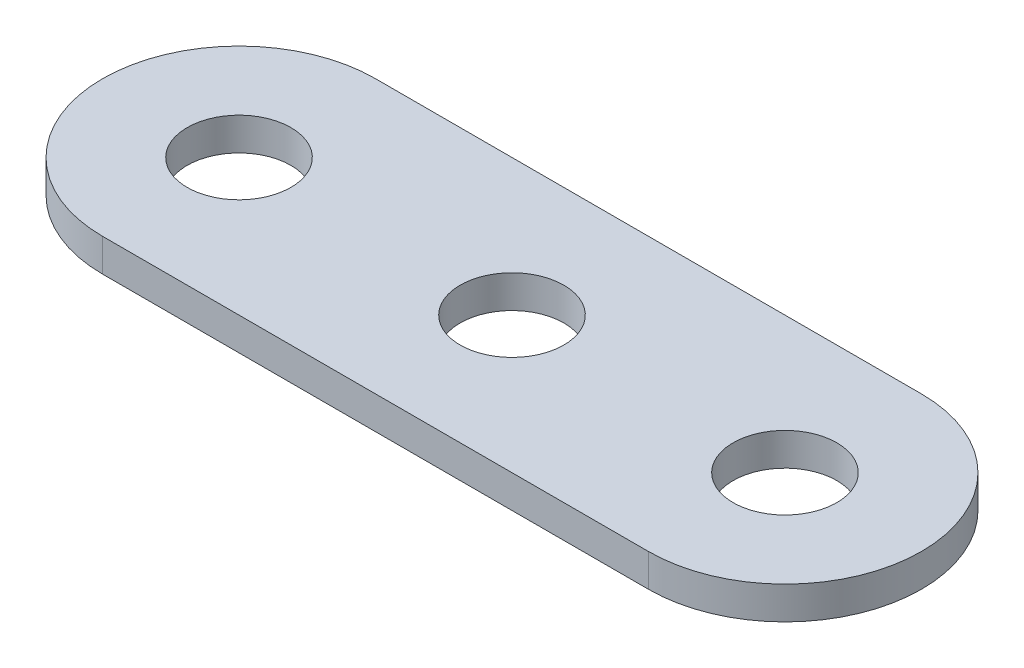
ISO-10303-21;
HEADER;
FILE_DESCRIPTION(('STEP AP214'),'2;1');
FILE_NAME('part.step','',(''),(''),'','','');
FILE_SCHEMA(('AUTOMOTIVE_DESIGN { 1 0 10303 214 1 1 1 1 }'));
ENDSEC;
DATA;
#1=APPLICATION_CONTEXT('core data for automotive mechanical design processes');
#2=APPLICATION_PROTOCOL_DEFINITION('international standard','automotive_design',2000,#1);
#3=PRODUCT_CONTEXT('',#1,'mechanical');
#4=PRODUCT('Part','Part','',(#3));
#5=PRODUCT_RELATED_PRODUCT_CATEGORY('part','',(#4));
#6=PRODUCT_DEFINITION_FORMATION('','',#4);
#7=PRODUCT_DEFINITION_CONTEXT('part definition',#1,'design');
#8=PRODUCT_DEFINITION('design','',#6,#7);
#9=PRODUCT_DEFINITION_SHAPE('','',#8);
#10=(LENGTH_UNIT() NAMED_UNIT(*) SI_UNIT(.MILLI.,.METRE.));
#11=(NAMED_UNIT(*) PLANE_ANGLE_UNIT() SI_UNIT($,.RADIAN.));
#12=(NAMED_UNIT(*) SI_UNIT($,.STERADIAN.) SOLID_ANGLE_UNIT());
#13=UNCERTAINTY_MEASURE_WITH_UNIT(LENGTH_MEASURE(1.E-05),#10,'distance_accuracy_value','');
#14=(GEOMETRIC_REPRESENTATION_CONTEXT(3) GLOBAL_UNCERTAINTY_ASSIGNED_CONTEXT((#13)) GLOBAL_UNIT_ASSIGNED_CONTEXT((#10,
#11,#12)) REPRESENTATION_CONTEXT('',''));
#15=CARTESIAN_POINT('',(0.,0.,0.));
#16=DIRECTION('',(0.,0.,1.));
#17=DIRECTION('',(1.,0.,0.));
#18=AXIS2_PLACEMENT_3D('',#15,#16,#17);
#19=CARTESIAN_POINT('',(0.,1.524,0.));
#20=DIRECTION('',(0.,1.,0.));
#21=DIRECTION('',(0.,0.,1.));
#22=AXIS2_PLACEMENT_3D('',#19,#20,#21);
#23=PLANE('',#22);
#24=CARTESIAN_POINT('',(-12.7,1.524,0.));
#25=DIRECTION('',(0.,1.,0.));
#26=DIRECTION('',(0.,0.,1.));
#27=AXIS2_PLACEMENT_3D('',#24,#25,#26);
#28=CIRCLE('',#27,2.413);
#29=CARTESIAN_POINT('',(-12.7,1.524,-2.413));
#30=VERTEX_POINT('',#29);
#31=EDGE_CURVE('E142',#30,#30,#28,.T.);
#32=ORIENTED_EDGE('',*,*,#31,.F.);
#33=EDGE_LOOP('',(#32));
#34=FACE_BOUND('',#33,.T.);
#35=CARTESIAN_POINT('',(0.,1.524,0.));
#36=DIRECTION('',(0.,1.,0.));
#37=DIRECTION('',(0.,0.,1.));
#38=AXIS2_PLACEMENT_3D('',#35,#36,#37);
#39=CIRCLE('',#38,6.35);
#40=CARTESIAN_POINT('',(0.,1.524,6.35));
#41=VERTEX_POINT('',#40);
#42=CARTESIAN_POINT('',(0.,1.524,-6.35));
#43=VERTEX_POINT('',#42);
#44=EDGE_CURVE('E94',#41,#43,#39,.T.);
#45=ORIENTED_EDGE('',*,*,#44,.T.);
#46=DIRECTION('',(-1.,0.,0.));
#47=VECTOR('',#46,1.);
#48=CARTESIAN_POINT('',(0.,1.524,-6.35));
#49=LINE('',#48,#47);
#50=CARTESIAN_POINT('',(-25.4,1.524,-6.35));
#51=VERTEX_POINT('',#50);
#52=EDGE_CURVE('E89',#43,#51,#49,.T.);
#53=ORIENTED_EDGE('',*,*,#52,.T.);
#54=CARTESIAN_POINT('',(-25.4,1.524,0.));
#55=DIRECTION('',(0.,1.,0.));
#56=DIRECTION('',(0.,0.,1.));
#57=AXIS2_PLACEMENT_3D('',#54,#55,#56);
#58=CIRCLE('',#57,6.35);
#59=CARTESIAN_POINT('',(-25.4,1.524,6.35000000000001));
#60=VERTEX_POINT('',#59);
#61=EDGE_CURVE('E92',#51,#60,#58,.T.);
#62=ORIENTED_EDGE('',*,*,#61,.T.);
#63=DIRECTION('',(1.,0.,0.));
#64=VECTOR('',#63,1.);
#65=CARTESIAN_POINT('',(0.,1.524,6.35));
#66=LINE('',#65,#64);
#67=EDGE_CURVE('E59',#60,#41,#66,.T.);
#68=ORIENTED_EDGE('',*,*,#67,.T.);
#69=EDGE_LOOP('',(#45,#53,#62,#68));
#70=FACE_BOUND('',#69,.T.);
#71=CARTESIAN_POINT('',(-25.4,1.524,0.));
#72=DIRECTION('',(0.,1.,0.));
#73=DIRECTION('',(0.,0.,1.));
#74=AXIS2_PLACEMENT_3D('',#71,#72,#73);
#75=CIRCLE('',#74,2.413);
#76=CARTESIAN_POINT('',(-25.4,1.524,-2.413));
#77=VERTEX_POINT('',#76);
#78=EDGE_CURVE('E116',#77,#77,#75,.T.);
#79=ORIENTED_EDGE('',*,*,#78,.F.);
#80=EDGE_LOOP('',(#79));
#81=FACE_BOUND('',#80,.T.);
#82=CARTESIAN_POINT('',(0.,1.524,0.));
#83=DIRECTION('',(0.,1.,0.));
#84=DIRECTION('',(0.,0.,1.));
#85=AXIS2_PLACEMENT_3D('',#82,#83,#84);
#86=CIRCLE('',#85,2.413);
#87=CARTESIAN_POINT('',(0.,1.524,-2.413));
#88=VERTEX_POINT('',#87);
#89=EDGE_CURVE('E150',#88,#88,#86,.T.);
#90=ORIENTED_EDGE('',*,*,#89,.F.);
#91=EDGE_LOOP('',(#90));
#92=FACE_BOUND('',#91,.T.);
#93=ADVANCED_FACE('F41',(#34,#70,#81,#92),#23,.T.);
#94=CARTESIAN_POINT('',(0.,0.,0.));
#95=DIRECTION('',(0.,1.,0.));
#96=DIRECTION('',(0.,0.,1.));
#97=AXIS2_PLACEMENT_3D('',#94,#95,#96);
#98=PLANE('',#97);
#99=CARTESIAN_POINT('',(0.,0.,0.));
#100=DIRECTION('',(0.,1.,0.));
#101=DIRECTION('',(0.,0.,1.));
#102=AXIS2_PLACEMENT_3D('',#99,#100,#101);
#103=CIRCLE('',#102,6.35);
#104=CARTESIAN_POINT('',(0.,0.,6.35));
#105=VERTEX_POINT('',#104);
#106=CARTESIAN_POINT('',(0.,0.,-6.35));
#107=VERTEX_POINT('',#106);
#108=EDGE_CURVE('E112',#105,#107,#103,.T.);
#109=ORIENTED_EDGE('',*,*,#108,.F.);
#110=DIRECTION('',(1.,0.,0.));
#111=VECTOR('',#110,1.);
#112=CARTESIAN_POINT('',(0.,0.,6.35));
#113=LINE('',#112,#111);
#114=CARTESIAN_POINT('',(-25.4,0.,6.35000000000001));
#115=VERTEX_POINT('',#114);
#116=EDGE_CURVE('E82',#115,#105,#113,.T.);
#117=ORIENTED_EDGE('',*,*,#116,.F.);
#118=CARTESIAN_POINT('',(-25.4,0.,0.));
#119=DIRECTION('',(0.,1.,0.));
#120=DIRECTION('',(0.,0.,1.));
#121=AXIS2_PLACEMENT_3D('',#118,#119,#120);
#122=CIRCLE('',#121,6.35);
#123=CARTESIAN_POINT('',(-25.4,0.,-6.35));
#124=VERTEX_POINT('',#123);
#125=EDGE_CURVE('E76',#124,#115,#122,.T.);
#126=ORIENTED_EDGE('',*,*,#125,.F.);
#127=DIRECTION('',(-1.,0.,0.));
#128=VECTOR('',#127,1.);
#129=CARTESIAN_POINT('',(0.,0.,-6.35));
#130=LINE('',#129,#128);
#131=EDGE_CURVE('E99',#107,#124,#130,.T.);
#132=ORIENTED_EDGE('',*,*,#131,.F.);
#133=EDGE_LOOP('',(#109,#117,#126,#132));
#134=FACE_BOUND('',#133,.T.);
#135=CARTESIAN_POINT('',(-25.4,0.,0.));
#136=DIRECTION('',(0.,1.,0.));
#137=DIRECTION('',(0.,0.,1.));
#138=AXIS2_PLACEMENT_3D('',#135,#136,#137);
#139=CIRCLE('',#138,2.413);
#140=CARTESIAN_POINT('',(-25.4,0.,-2.413));
#141=VERTEX_POINT('',#140);
#142=EDGE_CURVE('E138',#141,#141,#139,.T.);
#143=ORIENTED_EDGE('',*,*,#142,.T.);
#144=EDGE_LOOP('',(#143));
#145=FACE_BOUND('',#144,.T.);
#146=CARTESIAN_POINT('',(-12.7,0.,0.));
#147=DIRECTION('',(0.,1.,0.));
#148=DIRECTION('',(0.,0.,1.));
#149=AXIS2_PLACEMENT_3D('',#146,#147,#148);
#150=CIRCLE('',#149,2.413);
#151=CARTESIAN_POINT('',(-12.7,0.,-2.413));
#152=VERTEX_POINT('',#151);
#153=EDGE_CURVE('E146',#152,#152,#150,.T.);
#154=ORIENTED_EDGE('',*,*,#153,.T.);
#155=EDGE_LOOP('',(#154));
#156=FACE_BOUND('',#155,.T.);
#157=CARTESIAN_POINT('',(0.,0.,0.));
#158=DIRECTION('',(0.,1.,0.));
#159=DIRECTION('',(0.,0.,1.));
#160=AXIS2_PLACEMENT_3D('',#157,#158,#159);
#161=CIRCLE('',#160,2.413);
#162=CARTESIAN_POINT('',(0.,0.,-2.413));
#163=VERTEX_POINT('',#162);
#164=EDGE_CURVE('E154',#163,#163,#161,.T.);
#165=ORIENTED_EDGE('',*,*,#164,.T.);
#166=EDGE_LOOP('',(#165));
#167=FACE_BOUND('',#166,.T.);
#168=ADVANCED_FACE('F131',(#134,#145,#156,#167),#98,.F.);
#169=CARTESIAN_POINT('',(0.,1.524,0.));
#170=DIRECTION('',(0.,-1.,0.));
#171=DIRECTION('',(0.,0.,-1.));
#172=AXIS2_PLACEMENT_3D('',#169,#170,#171);
#173=CYLINDRICAL_SURFACE('',#172,6.35);
#174=ORIENTED_EDGE('',*,*,#108,.T.);
#175=DIRECTION('',(0.,-1.,0.));
#176=VECTOR('',#175,1.);
#177=CARTESIAN_POINT('',(0.,1.524,-6.35));
#178=LINE('',#177,#176);
#179=EDGE_CURVE('E11',#43,#107,#178,.T.);
#180=ORIENTED_EDGE('',*,*,#179,.F.);
#181=ORIENTED_EDGE('',*,*,#44,.F.);
#182=DIRECTION('',(0.,-1.,0.));
#183=VECTOR('',#182,1.);
#184=CARTESIAN_POINT('',(0.,1.524,6.35));
#185=LINE('',#184,#183);
#186=EDGE_CURVE('E108',#41,#105,#185,.T.);
#187=ORIENTED_EDGE('',*,*,#186,.T.);
#188=EDGE_LOOP('',(#174,#180,#181,#187));
#189=FACE_BOUND('',#188,.T.);
#190=ADVANCED_FACE('F43',(#189),#173,.T.);
#191=CARTESIAN_POINT('',(0.,1.524,-6.35));
#192=DIRECTION('',(0.,0.,1.));
#193=DIRECTION('',(1.,0.,0.));
#194=AXIS2_PLACEMENT_3D('',#191,#192,#193);
#195=PLANE('',#194);
#196=ORIENTED_EDGE('',*,*,#131,.T.);
#197=DIRECTION('',(0.,-1.,0.));
#198=VECTOR('',#197,1.);
#199=CARTESIAN_POINT('',(-25.4,1.524,-6.35));
#200=LINE('',#199,#198);
#201=EDGE_CURVE('E51',#51,#124,#200,.T.);
#202=ORIENTED_EDGE('',*,*,#201,.F.);
#203=ORIENTED_EDGE('',*,*,#52,.F.);
#204=ORIENTED_EDGE('',*,*,#179,.T.);
#205=EDGE_LOOP('',(#196,#202,#203,#204));
#206=FACE_BOUND('',#205,.T.);
#207=ADVANCED_FACE('F98',(#206),#195,.F.);
#208=CARTESIAN_POINT('',(-25.4,1.524,0.));
#209=DIRECTION('',(0.,-1.,0.));
#210=DIRECTION('',(0.,0.,-1.));
#211=AXIS2_PLACEMENT_3D('',#208,#209,#210);
#212=CYLINDRICAL_SURFACE('',#211,6.35);
#213=ORIENTED_EDGE('',*,*,#125,.T.);
#214=DIRECTION('',(0.,-1.,0.));
#215=VECTOR('',#214,1.);
#216=CARTESIAN_POINT('',(-25.4,1.524,6.35000000000001));
#217=LINE('',#216,#215);
#218=EDGE_CURVE('E101',#60,#115,#217,.T.);
#219=ORIENTED_EDGE('',*,*,#218,.F.);
#220=ORIENTED_EDGE('',*,*,#61,.F.);
#221=ORIENTED_EDGE('',*,*,#201,.T.);
#222=EDGE_LOOP('',(#213,#219,#220,#221));
#223=FACE_BOUND('',#222,.T.);
#224=ADVANCED_FACE('F102',(#223),#212,.T.);
#225=CARTESIAN_POINT('',(0.,1.524,6.35));
#226=DIRECTION('',(0.,0.,-1.));
#227=DIRECTION('',(-1.,0.,0.));
#228=AXIS2_PLACEMENT_3D('',#225,#226,#227);
#229=PLANE('',#228);
#230=ORIENTED_EDGE('',*,*,#116,.T.);
#231=ORIENTED_EDGE('',*,*,#186,.F.);
#232=ORIENTED_EDGE('',*,*,#67,.F.);
#233=ORIENTED_EDGE('',*,*,#218,.T.);
#234=EDGE_LOOP('',(#230,#231,#232,#233));
#235=FACE_BOUND('',#234,.T.);
#236=ADVANCED_FACE('F128',(#235),#229,.F.);
#237=CARTESIAN_POINT('',(-25.4,1.524,0.));
#238=DIRECTION('',(0.,-1.,0.));
#239=DIRECTION('',(0.,0.,-1.));
#240=AXIS2_PLACEMENT_3D('',#237,#238,#239);
#241=CYLINDRICAL_SURFACE('',#240,2.413);
#242=CARTESIAN_POINT('',(-25.4,1.524,-2.413));
#243=CARTESIAN_POINT('',(-25.4,1.508125,-2.413));
#244=CARTESIAN_POINT('',(-25.4,1.49225,-2.413));
#245=CARTESIAN_POINT('',(-25.4,1.4605,-2.413));
#246=CARTESIAN_POINT('',(-25.4,1.444625,-2.413));
#247=CARTESIAN_POINT('',(-25.4,1.412875,-2.413));
#248=CARTESIAN_POINT('',(-25.4,1.397,-2.413));
#249=CARTESIAN_POINT('',(-25.4,1.36525,-2.413));
#250=CARTESIAN_POINT('',(-25.4,1.349375,-2.413));
#251=CARTESIAN_POINT('',(-25.4,1.317625,-2.413));
#252=CARTESIAN_POINT('',(-25.4,1.30175,-2.413));
#253=CARTESIAN_POINT('',(-25.4,1.27,-2.413));
#254=CARTESIAN_POINT('',(-25.4,1.254125,-2.413));
#255=CARTESIAN_POINT('',(-25.4,1.222375,-2.413));
#256=CARTESIAN_POINT('',(-25.4,1.2065,-2.413));
#257=CARTESIAN_POINT('',(-25.4,1.17475,-2.413));
#258=CARTESIAN_POINT('',(-25.4,1.158875,-2.413));
#259=CARTESIAN_POINT('',(-25.4,1.127125,-2.413));
#260=CARTESIAN_POINT('',(-25.4,1.11125,-2.413));
#261=CARTESIAN_POINT('',(-25.4,1.0795,-2.413));
#262=CARTESIAN_POINT('',(-25.4,1.063625,-2.413));
#263=CARTESIAN_POINT('',(-25.4,1.031875,-2.413));
#264=CARTESIAN_POINT('',(-25.4,1.016,-2.413));
#265=CARTESIAN_POINT('',(-25.4,0.98425,-2.413));
#266=CARTESIAN_POINT('',(-25.4,0.968375,-2.413));
#267=CARTESIAN_POINT('',(-25.4,0.936625,-2.413));
#268=CARTESIAN_POINT('',(-25.4,0.92075,-2.413));
#269=CARTESIAN_POINT('',(-25.4,0.889,-2.413));
#270=CARTESIAN_POINT('',(-25.4,0.873125,-2.413));
#271=CARTESIAN_POINT('',(-25.4,0.841375,-2.413));
#272=CARTESIAN_POINT('',(-25.4,0.8255,-2.413));
#273=CARTESIAN_POINT('',(-25.4,0.79375,-2.413));
#274=CARTESIAN_POINT('',(-25.4,0.777875,-2.413));
#275=CARTESIAN_POINT('',(-25.4,0.746125,-2.413));
#276=CARTESIAN_POINT('',(-25.4,0.73025,-2.413));
#277=CARTESIAN_POINT('',(-25.4,0.6985,-2.413));
#278=CARTESIAN_POINT('',(-25.4,0.682625,-2.413));
#279=CARTESIAN_POINT('',(-25.4,0.650875,-2.413));
#280=CARTESIAN_POINT('',(-25.4,0.635,-2.413));
#281=CARTESIAN_POINT('',(-25.4,0.60325,-2.413));
#282=CARTESIAN_POINT('',(-25.4,0.587375,-2.413));
#283=CARTESIAN_POINT('',(-25.4,0.555625,-2.413));
#284=CARTESIAN_POINT('',(-25.4,0.53975,-2.413));
#285=CARTESIAN_POINT('',(-25.4,0.508,-2.413));
#286=CARTESIAN_POINT('',(-25.4,0.492125,-2.413));
#287=CARTESIAN_POINT('',(-25.4,0.460375,-2.413));
#288=CARTESIAN_POINT('',(-25.4,0.4445,-2.413));
#289=CARTESIAN_POINT('',(-25.4,0.41275,-2.413));
#290=CARTESIAN_POINT('',(-25.4,0.396875,-2.413));
#291=CARTESIAN_POINT('',(-25.4,0.365125,-2.413));
#292=CARTESIAN_POINT('',(-25.4,0.34925,-2.413));
#293=CARTESIAN_POINT('',(-25.4,0.3175,-2.413));
#294=CARTESIAN_POINT('',(-25.4,0.301625,-2.413));
#295=CARTESIAN_POINT('',(-25.4,0.269875,-2.413));
#296=CARTESIAN_POINT('',(-25.4,0.254,-2.413));
#297=CARTESIAN_POINT('',(-25.4,0.22225,-2.413));
#298=CARTESIAN_POINT('',(-25.4,0.206375,-2.413));
#299=CARTESIAN_POINT('',(-25.4,0.174625,-2.413));
#300=CARTESIAN_POINT('',(-25.4,0.15875,-2.413));
#301=CARTESIAN_POINT('',(-25.4,0.127,-2.413));
#302=CARTESIAN_POINT('',(-25.4,0.111125,-2.413));
#303=CARTESIAN_POINT('',(-25.4,0.079375,-2.413));
#304=CARTESIAN_POINT('',(-25.4,0.0635,-2.413));
#305=CARTESIAN_POINT('',(-25.4,0.0317499999999999,-2.413));
#306=CARTESIAN_POINT('',(-25.4,0.015875,-2.413));
#307=CARTESIAN_POINT('',(-25.4,0.,-2.413));
#308=B_SPLINE_CURVE_WITH_KNOTS('',3,(#242,#243,#244,#245,#246,#247,#248,#249,#250,#251,#252,
#253,#254,#255,#256,#257,#258,#259,#260,#261,#262,#263,#264,#265,#266,#267,#268,#269,#270,#271,
#272,#273,#274,#275,#276,#277,#278,#279,#280,#281,#282,#283,#284,#285,#286,#287,#288,#289,#290,
#291,#292,#293,#294,#295,#296,#297,#298,#299,#300,#301,#302,#303,#304,#305,#306,#307),
.UNSPECIFIED.,.F.,.F.,(4,2,2,2,2,2,2,2,2,2,2,2,2,2,2,2,2,2,2,2,2,2,2,2,2,2,2,2,2,2,2,2,4),(0.,
0.0476250000000001,0.0952500000000001,0.142875,0.1905,0.238125,0.28575,0.333375,0.381,0.428625,
0.47625,0.523875,0.5715,0.619125,0.66675,0.714375,0.762,0.809625,0.85725,0.904875,0.9525,
1.000125,1.04775,1.095375,1.143,1.190625,1.23825,1.285875,1.3335,1.381125,1.42875,1.476375,
1.524),.UNSPECIFIED.);
#309=EDGE_CURVE('BSEAM176',#77,#141,#308,.T.);
#310=ORIENTED_EDGE('',*,*,#78,.T.);
#311=ORIENTED_EDGE('',*,*,#142,.F.);
#312=ORIENTED_EDGE('',*,*,#309,.T.);
#313=ORIENTED_EDGE('',*,*,#309,.F.);
#314=EDGE_LOOP('',(#310,#312,#311,#313));
#315=FACE_BOUND('',#314,.T.);
#316=ADVANCED_FACE('F176',(#315),#241,.F.);
#317=CARTESIAN_POINT('',(-12.7,1.524,0.));
#318=DIRECTION('',(0.,-1.,0.));
#319=DIRECTION('',(0.,0.,-1.));
#320=AXIS2_PLACEMENT_3D('',#317,#318,#319);
#321=CYLINDRICAL_SURFACE('',#320,2.413);
#322=CARTESIAN_POINT('',(-12.7,1.524,-2.413));
#323=CARTESIAN_POINT('',(-12.7,1.508125,-2.413));
#324=CARTESIAN_POINT('',(-12.7,1.49225,-2.413));
#325=CARTESIAN_POINT('',(-12.7,1.4605,-2.413));
#326=CARTESIAN_POINT('',(-12.7,1.444625,-2.413));
#327=CARTESIAN_POINT('',(-12.7,1.412875,-2.413));
#328=CARTESIAN_POINT('',(-12.7,1.397,-2.413));
#329=CARTESIAN_POINT('',(-12.7,1.36525,-2.413));
#330=CARTESIAN_POINT('',(-12.7,1.349375,-2.413));
#331=CARTESIAN_POINT('',(-12.7,1.317625,-2.413));
#332=CARTESIAN_POINT('',(-12.7,1.30175,-2.413));
#333=CARTESIAN_POINT('',(-12.7,1.27,-2.413));
#334=CARTESIAN_POINT('',(-12.7,1.254125,-2.413));
#335=CARTESIAN_POINT('',(-12.7,1.222375,-2.413));
#336=CARTESIAN_POINT('',(-12.7,1.2065,-2.413));
#337=CARTESIAN_POINT('',(-12.7,1.17475,-2.413));
#338=CARTESIAN_POINT('',(-12.7,1.158875,-2.413));
#339=CARTESIAN_POINT('',(-12.7,1.127125,-2.413));
#340=CARTESIAN_POINT('',(-12.7,1.11125,-2.413));
#341=CARTESIAN_POINT('',(-12.7,1.0795,-2.413));
#342=CARTESIAN_POINT('',(-12.7,1.063625,-2.413));
#343=CARTESIAN_POINT('',(-12.7,1.031875,-2.413));
#344=CARTESIAN_POINT('',(-12.7,1.016,-2.413));
#345=CARTESIAN_POINT('',(-12.7,0.98425,-2.413));
#346=CARTESIAN_POINT('',(-12.7,0.968375,-2.413));
#347=CARTESIAN_POINT('',(-12.7,0.936625,-2.413));
#348=CARTESIAN_POINT('',(-12.7,0.92075,-2.413));
#349=CARTESIAN_POINT('',(-12.7,0.889,-2.413));
#350=CARTESIAN_POINT('',(-12.7,0.873125,-2.413));
#351=CARTESIAN_POINT('',(-12.7,0.841375,-2.413));
#352=CARTESIAN_POINT('',(-12.7,0.8255,-2.413));
#353=CARTESIAN_POINT('',(-12.7,0.79375,-2.413));
#354=CARTESIAN_POINT('',(-12.7,0.777875,-2.413));
#355=CARTESIAN_POINT('',(-12.7,0.746125,-2.413));
#356=CARTESIAN_POINT('',(-12.7,0.73025,-2.413));
#357=CARTESIAN_POINT('',(-12.7,0.6985,-2.413));
#358=CARTESIAN_POINT('',(-12.7,0.682625,-2.413));
#359=CARTESIAN_POINT('',(-12.7,0.650875,-2.413));
#360=CARTESIAN_POINT('',(-12.7,0.635,-2.413));
#361=CARTESIAN_POINT('',(-12.7,0.60325,-2.413));
#362=CARTESIAN_POINT('',(-12.7,0.587375,-2.413));
#363=CARTESIAN_POINT('',(-12.7,0.555625,-2.413));
#364=CARTESIAN_POINT('',(-12.7,0.53975,-2.413));
#365=CARTESIAN_POINT('',(-12.7,0.508,-2.413));
#366=CARTESIAN_POINT('',(-12.7,0.492125,-2.413));
#367=CARTESIAN_POINT('',(-12.7,0.460375,-2.413));
#368=CARTESIAN_POINT('',(-12.7,0.4445,-2.413));
#369=CARTESIAN_POINT('',(-12.7,0.41275,-2.413));
#370=CARTESIAN_POINT('',(-12.7,0.396875,-2.413));
#371=CARTESIAN_POINT('',(-12.7,0.365125,-2.413));
#372=CARTESIAN_POINT('',(-12.7,0.34925,-2.413));
#373=CARTESIAN_POINT('',(-12.7,0.3175,-2.413));
#374=CARTESIAN_POINT('',(-12.7,0.301625,-2.413));
#375=CARTESIAN_POINT('',(-12.7,0.269875,-2.413));
#376=CARTESIAN_POINT('',(-12.7,0.254,-2.413));
#377=CARTESIAN_POINT('',(-12.7,0.22225,-2.413));
#378=CARTESIAN_POINT('',(-12.7,0.206375,-2.413));
#379=CARTESIAN_POINT('',(-12.7,0.174625,-2.413));
#380=CARTESIAN_POINT('',(-12.7,0.15875,-2.413));
#381=CARTESIAN_POINT('',(-12.7,0.127,-2.413));
#382=CARTESIAN_POINT('',(-12.7,0.111125,-2.413));
#383=CARTESIAN_POINT('',(-12.7,0.079375,-2.413));
#384=CARTESIAN_POINT('',(-12.7,0.0635,-2.413));
#385=CARTESIAN_POINT('',(-12.7,0.0317499999999999,-2.413));
#386=CARTESIAN_POINT('',(-12.7,0.015875,-2.413));
#387=CARTESIAN_POINT('',(-12.7,0.,-2.413));
#388=B_SPLINE_CURVE_WITH_KNOTS('',3,(#322,#323,#324,#325,#326,#327,#328,#329,#330,#331,#332,
#333,#334,#335,#336,#337,#338,#339,#340,#341,#342,#343,#344,#345,#346,#347,#348,#349,#350,#351,
#352,#353,#354,#355,#356,#357,#358,#359,#360,#361,#362,#363,#364,#365,#366,#367,#368,#369,#370,
#371,#372,#373,#374,#375,#376,#377,#378,#379,#380,#381,#382,#383,#384,#385,#386,#387),
.UNSPECIFIED.,.F.,.F.,(4,2,2,2,2,2,2,2,2,2,2,2,2,2,2,2,2,2,2,2,2,2,2,2,2,2,2,2,2,2,2,2,4),(0.,
0.0476250000000001,0.0952500000000001,0.142875,0.1905,0.238125,0.28575,0.333375,0.381,0.428625,
0.47625,0.523875,0.5715,0.619125,0.66675,0.714375,0.762,0.809625,0.85725,0.904875,0.9525,
1.000125,1.04775,1.095375,1.143,1.190625,1.23825,1.285875,1.3335,1.381125,1.42875,1.476375,
1.524),.UNSPECIFIED.);
#389=EDGE_CURVE('BSEAM231',#30,#152,#388,.T.);
#390=ORIENTED_EDGE('',*,*,#31,.T.);
#391=ORIENTED_EDGE('',*,*,#153,.F.);
#392=ORIENTED_EDGE('',*,*,#389,.T.);
#393=ORIENTED_EDGE('',*,*,#389,.F.);
#394=EDGE_LOOP('',(#390,#392,#391,#393));
#395=FACE_BOUND('',#394,.T.);
#396=ADVANCED_FACE('F231',(#395),#321,.F.);
#397=CARTESIAN_POINT('',(0.,1.524,0.));
#398=DIRECTION('',(0.,-1.,0.));
#399=DIRECTION('',(0.,0.,-1.));
#400=AXIS2_PLACEMENT_3D('',#397,#398,#399);
#401=CYLINDRICAL_SURFACE('',#400,2.413);
#402=CARTESIAN_POINT('',(0.,1.524,-2.413));
#403=CARTESIAN_POINT('',(0.,1.508125,-2.413));
#404=CARTESIAN_POINT('',(0.,1.49225,-2.413));
#405=CARTESIAN_POINT('',(0.,1.4605,-2.413));
#406=CARTESIAN_POINT('',(0.,1.444625,-2.413));
#407=CARTESIAN_POINT('',(0.,1.412875,-2.413));
#408=CARTESIAN_POINT('',(0.,1.397,-2.413));
#409=CARTESIAN_POINT('',(0.,1.36525,-2.413));
#410=CARTESIAN_POINT('',(0.,1.349375,-2.413));
#411=CARTESIAN_POINT('',(0.,1.317625,-2.413));
#412=CARTESIAN_POINT('',(0.,1.30175,-2.413));
#413=CARTESIAN_POINT('',(0.,1.27,-2.413));
#414=CARTESIAN_POINT('',(0.,1.254125,-2.413));
#415=CARTESIAN_POINT('',(0.,1.222375,-2.413));
#416=CARTESIAN_POINT('',(0.,1.2065,-2.413));
#417=CARTESIAN_POINT('',(0.,1.17475,-2.413));
#418=CARTESIAN_POINT('',(0.,1.158875,-2.413));
#419=CARTESIAN_POINT('',(0.,1.127125,-2.413));
#420=CARTESIAN_POINT('',(0.,1.11125,-2.413));
#421=CARTESIAN_POINT('',(0.,1.0795,-2.413));
#422=CARTESIAN_POINT('',(0.,1.063625,-2.413));
#423=CARTESIAN_POINT('',(0.,1.031875,-2.413));
#424=CARTESIAN_POINT('',(0.,1.016,-2.413));
#425=CARTESIAN_POINT('',(0.,0.98425,-2.413));
#426=CARTESIAN_POINT('',(0.,0.968375,-2.413));
#427=CARTESIAN_POINT('',(0.,0.936625,-2.413));
#428=CARTESIAN_POINT('',(0.,0.92075,-2.413));
#429=CARTESIAN_POINT('',(0.,0.889,-2.413));
#430=CARTESIAN_POINT('',(0.,0.873125,-2.413));
#431=CARTESIAN_POINT('',(0.,0.841375,-2.413));
#432=CARTESIAN_POINT('',(0.,0.8255,-2.413));
#433=CARTESIAN_POINT('',(0.,0.79375,-2.413));
#434=CARTESIAN_POINT('',(0.,0.777875,-2.413));
#435=CARTESIAN_POINT('',(0.,0.746125,-2.413));
#436=CARTESIAN_POINT('',(0.,0.73025,-2.413));
#437=CARTESIAN_POINT('',(0.,0.6985,-2.413));
#438=CARTESIAN_POINT('',(0.,0.682625,-2.413));
#439=CARTESIAN_POINT('',(0.,0.650875,-2.413));
#440=CARTESIAN_POINT('',(0.,0.635,-2.413));
#441=CARTESIAN_POINT('',(0.,0.60325,-2.413));
#442=CARTESIAN_POINT('',(0.,0.587375,-2.413));
#443=CARTESIAN_POINT('',(0.,0.555625,-2.413));
#444=CARTESIAN_POINT('',(0.,0.53975,-2.413));
#445=CARTESIAN_POINT('',(0.,0.508,-2.413));
#446=CARTESIAN_POINT('',(0.,0.492125,-2.413));
#447=CARTESIAN_POINT('',(0.,0.460375,-2.413));
#448=CARTESIAN_POINT('',(0.,0.4445,-2.413));
#449=CARTESIAN_POINT('',(0.,0.41275,-2.413));
#450=CARTESIAN_POINT('',(0.,0.396875,-2.413));
#451=CARTESIAN_POINT('',(0.,0.365125,-2.413));
#452=CARTESIAN_POINT('',(0.,0.34925,-2.413));
#453=CARTESIAN_POINT('',(0.,0.3175,-2.413));
#454=CARTESIAN_POINT('',(0.,0.301625,-2.413));
#455=CARTESIAN_POINT('',(0.,0.269875,-2.413));
#456=CARTESIAN_POINT('',(0.,0.254,-2.413));
#457=CARTESIAN_POINT('',(0.,0.22225,-2.413));
#458=CARTESIAN_POINT('',(0.,0.206375,-2.413));
#459=CARTESIAN_POINT('',(0.,0.174625,-2.413));
#460=CARTESIAN_POINT('',(0.,0.15875,-2.413));
#461=CARTESIAN_POINT('',(0.,0.127,-2.413));
#462=CARTESIAN_POINT('',(0.,0.111125,-2.413));
#463=CARTESIAN_POINT('',(0.,0.079375,-2.413));
#464=CARTESIAN_POINT('',(0.,0.0635,-2.413));
#465=CARTESIAN_POINT('',(0.,0.0317499999999999,-2.413));
#466=CARTESIAN_POINT('',(0.,0.015875,-2.413));
#467=CARTESIAN_POINT('',(0.,0.,-2.413));
#468=B_SPLINE_CURVE_WITH_KNOTS('',3,(#402,#403,#404,#405,#406,#407,#408,#409,#410,#411,#412,
#413,#414,#415,#416,#417,#418,#419,#420,#421,#422,#423,#424,#425,#426,#427,#428,#429,#430,#431,
#432,#433,#434,#435,#436,#437,#438,#439,#440,#441,#442,#443,#444,#445,#446,#447,#448,#449,#450,
#451,#452,#453,#454,#455,#456,#457,#458,#459,#460,#461,#462,#463,#464,#465,#466,#467),
.UNSPECIFIED.,.F.,.F.,(4,2,2,2,2,2,2,2,2,2,2,2,2,2,2,2,2,2,2,2,2,2,2,2,2,2,2,2,2,2,2,2,4),(0.,
0.0476250000000001,0.0952500000000001,0.142875,0.1905,0.238125,0.28575,0.333375,0.381,0.428625,
0.47625,0.523875,0.5715,0.619125,0.66675,0.714375,0.762,0.809625,0.85725,0.904875,0.9525,
1.000125,1.04775,1.095375,1.143,1.190625,1.23825,1.285875,1.3335,1.381125,1.42875,1.476375,
1.524),.UNSPECIFIED.);
#469=EDGE_CURVE('BSEAM164',#88,#163,#468,.T.);
#470=ORIENTED_EDGE('',*,*,#89,.T.);
#471=ORIENTED_EDGE('',*,*,#164,.F.);
#472=ORIENTED_EDGE('',*,*,#469,.T.);
#473=ORIENTED_EDGE('',*,*,#469,.F.);
#474=EDGE_LOOP('',(#470,#472,#471,#473));
#475=FACE_BOUND('',#474,.T.);
#476=ADVANCED_FACE('F164',(#475),#401,.F.);
#477=CLOSED_SHELL('',(#93,#168,#190,#207,#224,#236,#316,#396,#476));
#478=MANIFOLD_SOLID_BREP('B2',#477);
#479=ADVANCED_BREP_SHAPE_REPRESENTATION('',(#18,#478),#14);
#480=SHAPE_DEFINITION_REPRESENTATION(#9,#479);
ENDSEC;
END-ISO-10303-21;
